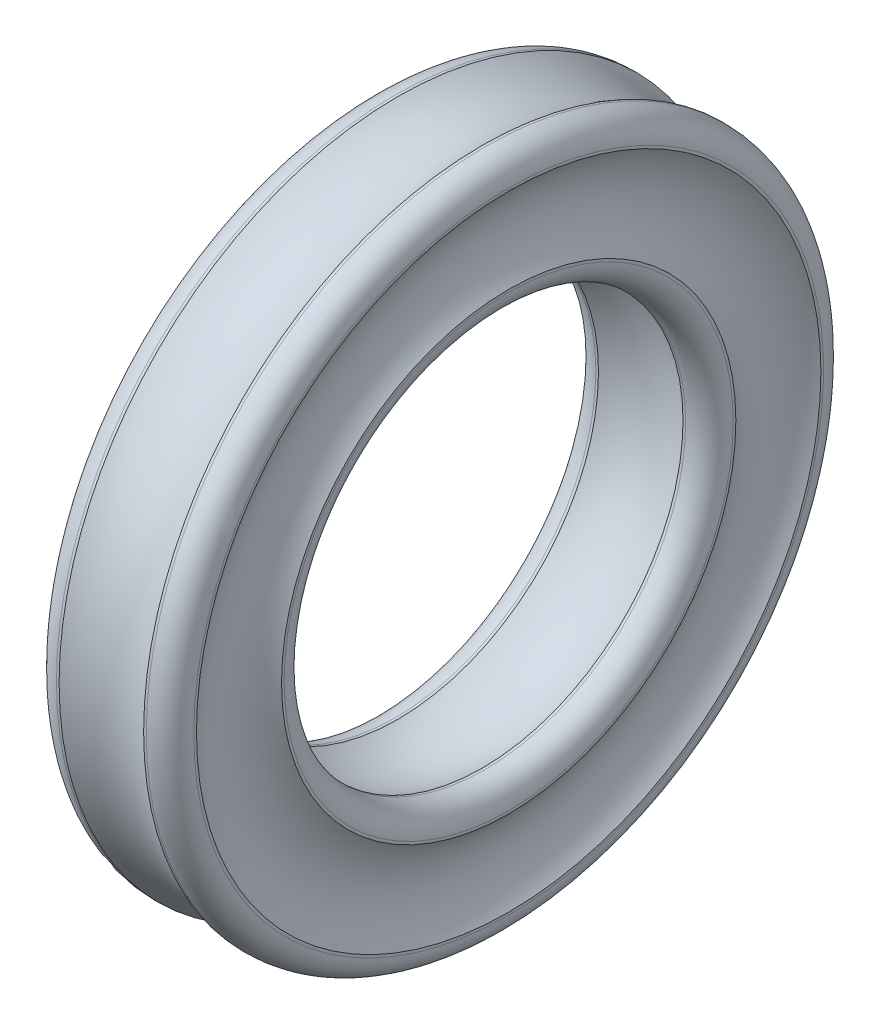
ISO-10303-21;
HEADER;
FILE_DESCRIPTION(('STEP AP214'),'2;1');
FILE_NAME('part.step','',(''),(''),'','','');
FILE_SCHEMA(('AUTOMOTIVE_DESIGN { 1 0 10303 214 1 1 1 1 }'));
ENDSEC;
DATA;
#1=APPLICATION_CONTEXT('core data for automotive mechanical design processes');
#2=APPLICATION_PROTOCOL_DEFINITION('international standard','automotive_design',2000,#1);
#3=PRODUCT_CONTEXT('',#1,'mechanical');
#4=PRODUCT('Part','Part','',(#3));
#5=PRODUCT_RELATED_PRODUCT_CATEGORY('part','',(#4));
#6=PRODUCT_DEFINITION_FORMATION('','',#4);
#7=PRODUCT_DEFINITION_CONTEXT('part definition',#1,'design');
#8=PRODUCT_DEFINITION('design','',#6,#7);
#9=PRODUCT_DEFINITION_SHAPE('','',#8);
#10=(LENGTH_UNIT() NAMED_UNIT(*) SI_UNIT(.MILLI.,.METRE.));
#11=(NAMED_UNIT(*) PLANE_ANGLE_UNIT() SI_UNIT($,.RADIAN.));
#12=(NAMED_UNIT(*) SI_UNIT($,.STERADIAN.) SOLID_ANGLE_UNIT());
#13=UNCERTAINTY_MEASURE_WITH_UNIT(LENGTH_MEASURE(1.E-05),#10,'distance_accuracy_value','');
#14=(GEOMETRIC_REPRESENTATION_CONTEXT(3) GLOBAL_UNCERTAINTY_ASSIGNED_CONTEXT((#13)) GLOBAL_UNIT_ASSIGNED_CONTEXT((#10,
#11,#12)) REPRESENTATION_CONTEXT('',''));
#15=CARTESIAN_POINT('',(0.,0.,0.));
#16=DIRECTION('',(0.,0.,1.));
#17=DIRECTION('',(1.,0.,0.));
#18=AXIS2_PLACEMENT_3D('',#15,#16,#17);
#19=CARTESIAN_POINT('',(1.3,5.91,0.));
#20=DIRECTION('',(-1.,0.,0.));
#21=DIRECTION('',(0.,0.,1.));
#22=AXIS2_PLACEMENT_3D('',#19,#20,#21);
#23=PLANE('',#22);
#24=CARTESIAN_POINT('',(1.3,0.,0.));
#25=DIRECTION('',(-1.,0.,0.));
#26=DIRECTION('',(0.,0.,1.));
#27=AXIS2_PLACEMENT_3D('',#24,#25,#26);
#28=CIRCLE('',#27,5.96);
#29=CARTESIAN_POINT('',(1.3,0.,5.96));
#30=VERTEX_POINT('',#29);
#31=EDGE_CURVE('E10',#30,#30,#28,.F.);
#32=ORIENTED_EDGE('',*,*,#31,.T.);
#33=EDGE_LOOP('',(#32));
#34=FACE_BOUND('',#33,.T.);
#35=CARTESIAN_POINT('',(1.3,0.,0.));
#36=DIRECTION('',(-1.,0.,0.));
#37=DIRECTION('',(0.,0.,1.));
#38=AXIS2_PLACEMENT_3D('',#35,#36,#37);
#39=CIRCLE('',#38,5.91);
#40=CARTESIAN_POINT('',(1.3,0.,5.91));
#41=VERTEX_POINT('',#40);
#42=EDGE_CURVE('E86',#41,#41,#39,.T.);
#43=ORIENTED_EDGE('',*,*,#42,.T.);
#44=EDGE_LOOP('',(#43));
#45=FACE_BOUND('',#44,.T.);
#46=ADVANCED_FACE('F34',(#34,#45),#23,.F.);
#47=CARTESIAN_POINT('',(0.,0.,0.));
#48=DIRECTION('',(-1.,0.,0.));
#49=DIRECTION('',(0.,0.,1.));
#50=AXIS2_PLACEMENT_3D('',#47,#48,#49);
#51=CYLINDRICAL_SURFACE('',#50,6.41);
#52=CARTESIAN_POINT('',(0.85,0.,0.));
#53=DIRECTION('',(-1.,0.,0.));
#54=DIRECTION('',(0.,0.,1.));
#55=AXIS2_PLACEMENT_3D('',#52,#53,#54);
#56=CIRCLE('',#55,6.41);
#57=CARTESIAN_POINT('',(0.85,0.,6.41));
#58=VERTEX_POINT('',#57);
#59=EDGE_CURVE('E45',#58,#58,#56,.T.);
#60=ORIENTED_EDGE('',*,*,#59,.T.);
#61=EDGE_LOOP('',(#60));
#62=FACE_BOUND('',#61,.T.);
#63=CARTESIAN_POINT('',(0.8,0.,0.));
#64=DIRECTION('',(-1.,0.,0.));
#65=DIRECTION('',(0.,0.,1.));
#66=AXIS2_PLACEMENT_3D('',#63,#64,#65);
#67=CIRCLE('',#66,6.41);
#68=CARTESIAN_POINT('',(0.8,0.,6.41));
#69=VERTEX_POINT('',#68);
#70=EDGE_CURVE('E69',#69,#69,#67,.T.);
#71=ORIENTED_EDGE('',*,*,#70,.F.);
#72=EDGE_LOOP('',(#71));
#73=FACE_BOUND('',#72,.T.);
#74=ADVANCED_FACE('F114',(#62,#73),#51,.T.);
#75=CARTESIAN_POINT('',(0.,0.,0.));
#76=DIRECTION('',(-1.,0.,0.));
#77=DIRECTION('',(0.,0.,1.));
#78=AXIS2_PLACEMENT_3D('',#75,#76,#77);
#79=TOROIDAL_SURFACE('',#78,7.79251104729134,1.59729045445173);
#80=CARTESIAN_POINT('',(-0.8,0.,0.));
#81=DIRECTION('',(-1.,0.,0.));
#82=DIRECTION('',(0.,0.,1.));
#83=AXIS2_PLACEMENT_3D('',#80,#81,#82);
#84=CIRCLE('',#83,6.41);
#85=CARTESIAN_POINT('',(-0.8,0.,6.41));
#86=VERTEX_POINT('',#85);
#87=EDGE_CURVE('E66',#86,#86,#84,.T.);
#88=ORIENTED_EDGE('',*,*,#87,.F.);
#89=EDGE_LOOP('',(#88));
#90=FACE_BOUND('',#89,.T.);
#91=ORIENTED_EDGE('',*,*,#70,.T.);
#92=EDGE_LOOP('',(#91));
#93=FACE_BOUND('',#92,.T.);
#94=ADVANCED_FACE('F117',(#90,#93),#79,.F.);
#95=CARTESIAN_POINT('',(0.,0.,0.));
#96=DIRECTION('',(-1.,0.,0.));
#97=DIRECTION('',(0.,0.,1.));
#98=AXIS2_PLACEMENT_3D('',#95,#96,#97);
#99=CYLINDRICAL_SURFACE('',#98,6.41);
#100=CARTESIAN_POINT('',(-0.85,0.,0.));
#101=DIRECTION('',(1.,0.,0.));
#102=DIRECTION('',(0.,0.,-1.));
#103=AXIS2_PLACEMENT_3D('',#100,#101,#102);
#104=CIRCLE('',#103,6.41);
#105=CARTESIAN_POINT('',(-0.85,0.,-6.41));
#106=VERTEX_POINT('',#105);
#107=EDGE_CURVE('E54',#106,#106,#104,.T.);
#108=ORIENTED_EDGE('',*,*,#107,.T.);
#109=EDGE_LOOP('',(#108));
#110=FACE_BOUND('',#109,.T.);
#111=ORIENTED_EDGE('',*,*,#87,.T.);
#112=EDGE_LOOP('',(#111));
#113=FACE_BOUND('',#112,.T.);
#114=ADVANCED_FACE('F162',(#110,#113),#99,.T.);
#115=CARTESIAN_POINT('',(-1.3,5.91,0.));
#116=DIRECTION('',(1.,0.,0.));
#117=DIRECTION('',(0.,0.,-1.));
#118=AXIS2_PLACEMENT_3D('',#115,#116,#117);
#119=PLANE('',#118);
#120=CARTESIAN_POINT('',(-1.3,0.,0.));
#121=DIRECTION('',(1.,0.,0.));
#122=DIRECTION('',(0.,0.,-1.));
#123=AXIS2_PLACEMENT_3D('',#120,#121,#122);
#124=CIRCLE('',#123,5.96);
#125=CARTESIAN_POINT('',(-1.3,0.,-5.96));
#126=VERTEX_POINT('',#125);
#127=EDGE_CURVE('E59',#126,#126,#124,.F.);
#128=ORIENTED_EDGE('',*,*,#127,.T.);
#129=EDGE_LOOP('',(#128));
#130=FACE_BOUND('',#129,.T.);
#131=CARTESIAN_POINT('',(-1.3,0.,0.));
#132=DIRECTION('',(-1.,0.,0.));
#133=DIRECTION('',(0.,0.,1.));
#134=AXIS2_PLACEMENT_3D('',#131,#132,#133);
#135=CIRCLE('',#134,5.91);
#136=CARTESIAN_POINT('',(-1.3,0.,5.91));
#137=VERTEX_POINT('',#136);
#138=EDGE_CURVE('E71',#137,#137,#135,.T.);
#139=ORIENTED_EDGE('',*,*,#138,.F.);
#140=EDGE_LOOP('',(#139));
#141=FACE_BOUND('',#140,.T.);
#142=ADVANCED_FACE('F157',(#130,#141),#119,.F.);
#143=CARTESIAN_POINT('',(-2.36556322767259,0.,0.));
#144=DIRECTION('',(-1.,0.,0.));
#145=DIRECTION('',(0.,0.,1.));
#146=AXIS2_PLACEMENT_3D('',#143,#144,#145);
#147=TOROIDAL_SURFACE('',#146,5.105,1.33545871975439);
#148=CARTESIAN_POINT('',(-1.3,0.,0.));
#149=DIRECTION('',(-1.,0.,0.));
#150=DIRECTION('',(0.,0.,1.));
#151=AXIS2_PLACEMENT_3D('',#148,#149,#150);
#152=CIRCLE('',#151,4.3);
#153=CARTESIAN_POINT('',(-1.3,0.,4.3));
#154=VERTEX_POINT('',#153);
#155=EDGE_CURVE('E76',#154,#154,#152,.T.);
#156=ORIENTED_EDGE('',*,*,#155,.F.);
#157=EDGE_LOOP('',(#156));
#158=FACE_BOUND('',#157,.T.);
#159=ORIENTED_EDGE('',*,*,#138,.T.);
#160=EDGE_LOOP('',(#159));
#161=FACE_BOUND('',#160,.T.);
#162=ADVANCED_FACE('F153',(#158,#161),#147,.F.);
#163=CARTESIAN_POINT('',(-1.3,3.8,0.));
#164=DIRECTION('',(1.,0.,0.));
#165=DIRECTION('',(0.,0.,-1.));
#166=AXIS2_PLACEMENT_3D('',#163,#164,#165);
#167=PLANE('',#166);
#168=CARTESIAN_POINT('',(-1.3,0.,0.));
#169=DIRECTION('',(1.,0.,0.));
#170=DIRECTION('',(0.,0.,-1.));
#171=AXIS2_PLACEMENT_3D('',#168,#169,#170);
#172=CIRCLE('',#171,4.25);
#173=CARTESIAN_POINT('',(-1.3,0.,-4.25));
#174=VERTEX_POINT('',#173);
#175=EDGE_CURVE('E61',#174,#174,#172,.T.);
#176=ORIENTED_EDGE('',*,*,#175,.T.);
#177=EDGE_LOOP('',(#176));
#178=FACE_BOUND('',#177,.T.);
#179=ORIENTED_EDGE('',*,*,#155,.T.);
#180=EDGE_LOOP('',(#179));
#181=FACE_BOUND('',#180,.T.);
#182=ADVANCED_FACE('F150',(#178,#181),#167,.F.);
#183=CARTESIAN_POINT('',(0.,0.,0.));
#184=DIRECTION('',(-1.,0.,0.));
#185=DIRECTION('',(0.,0.,1.));
#186=AXIS2_PLACEMENT_3D('',#183,#184,#185);
#187=CYLINDRICAL_SURFACE('',#186,3.8);
#188=CARTESIAN_POINT('',(-0.85,0.,0.));
#189=DIRECTION('',(1.,0.,0.));
#190=DIRECTION('',(0.,0.,-1.));
#191=AXIS2_PLACEMENT_3D('',#188,#189,#190);
#192=CIRCLE('',#191,3.8);
#193=CARTESIAN_POINT('',(-0.85,0.,-3.8));
#194=VERTEX_POINT('',#193);
#195=EDGE_CURVE('E63',#194,#194,#192,.F.);
#196=ORIENTED_EDGE('',*,*,#195,.T.);
#197=EDGE_LOOP('',(#196));
#198=FACE_BOUND('',#197,.T.);
#199=CARTESIAN_POINT('',(-0.8,0.,0.));
#200=DIRECTION('',(-1.,0.,0.));
#201=DIRECTION('',(0.,0.,1.));
#202=AXIS2_PLACEMENT_3D('',#199,#200,#201);
#203=CIRCLE('',#202,3.8);
#204=CARTESIAN_POINT('',(-0.8,0.,3.8));
#205=VERTEX_POINT('',#204);
#206=EDGE_CURVE('E78',#205,#205,#203,.T.);
#207=ORIENTED_EDGE('',*,*,#206,.F.);
#208=EDGE_LOOP('',(#207));
#209=FACE_BOUND('',#208,.T.);
#210=ADVANCED_FACE('F142',(#198,#209),#187,.F.);
#211=CARTESIAN_POINT('',(0.,0.,0.));
#212=DIRECTION('',(-1.,0.,0.));
#213=DIRECTION('',(0.,0.,1.));
#214=AXIS2_PLACEMENT_3D('',#211,#212,#213);
#215=TOROIDAL_SURFACE('',#214,2.41748895270866,1.59729045445173);
#216=CARTESIAN_POINT('',(0.799999999999999,0.,0.));
#217=DIRECTION('',(-1.,0.,0.));
#218=DIRECTION('',(0.,0.,1.));
#219=AXIS2_PLACEMENT_3D('',#216,#217,#218);
#220=CIRCLE('',#219,3.8);
#221=CARTESIAN_POINT('',(0.799999999999999,0.,3.8));
#222=VERTEX_POINT('',#221);
#223=EDGE_CURVE('E81',#222,#222,#220,.T.);
#224=ORIENTED_EDGE('',*,*,#223,.F.);
#225=EDGE_LOOP('',(#224));
#226=FACE_BOUND('',#225,.T.);
#227=ORIENTED_EDGE('',*,*,#206,.T.);
#228=EDGE_LOOP('',(#227));
#229=FACE_BOUND('',#228,.T.);
#230=ADVANCED_FACE('F108',(#226,#229),#215,.F.);
#231=CARTESIAN_POINT('',(0.,0.,0.));
#232=DIRECTION('',(-1.,0.,0.));
#233=DIRECTION('',(0.,0.,1.));
#234=AXIS2_PLACEMENT_3D('',#231,#232,#233);
#235=CYLINDRICAL_SURFACE('',#234,3.8);
#236=CARTESIAN_POINT('',(0.85,0.,0.));
#237=DIRECTION('',(-1.,0.,0.));
#238=DIRECTION('',(0.,0.,1.));
#239=AXIS2_PLACEMENT_3D('',#236,#237,#238);
#240=CIRCLE('',#239,3.8);
#241=CARTESIAN_POINT('',(0.85,0.,3.8));
#242=VERTEX_POINT('',#241);
#243=EDGE_CURVE('E46',#242,#242,#240,.F.);
#244=ORIENTED_EDGE('',*,*,#243,.T.);
#245=EDGE_LOOP('',(#244));
#246=FACE_BOUND('',#245,.T.);
#247=ORIENTED_EDGE('',*,*,#223,.T.);
#248=EDGE_LOOP('',(#247));
#249=FACE_BOUND('',#248,.T.);
#250=ADVANCED_FACE('F105',(#246,#249),#235,.F.);
#251=CARTESIAN_POINT('',(1.3,3.8,0.));
#252=DIRECTION('',(-1.,0.,0.));
#253=DIRECTION('',(0.,0.,1.));
#254=AXIS2_PLACEMENT_3D('',#251,#252,#253);
#255=PLANE('',#254);
#256=CARTESIAN_POINT('',(1.3,0.,0.));
#257=DIRECTION('',(-1.,0.,0.));
#258=DIRECTION('',(0.,0.,1.));
#259=AXIS2_PLACEMENT_3D('',#256,#257,#258);
#260=CIRCLE('',#259,4.25);
#261=CARTESIAN_POINT('',(1.3,0.,4.25));
#262=VERTEX_POINT('',#261);
#263=EDGE_CURVE('E49',#262,#262,#260,.T.);
#264=ORIENTED_EDGE('',*,*,#263,.T.);
#265=EDGE_LOOP('',(#264));
#266=FACE_BOUND('',#265,.T.);
#267=CARTESIAN_POINT('',(1.3,0.,0.));
#268=DIRECTION('',(-1.,0.,0.));
#269=DIRECTION('',(0.,0.,1.));
#270=AXIS2_PLACEMENT_3D('',#267,#268,#269);
#271=CIRCLE('',#270,4.3);
#272=CARTESIAN_POINT('',(1.3,0.,4.3));
#273=VERTEX_POINT('',#272);
#274=EDGE_CURVE('E82',#273,#273,#271,.T.);
#275=ORIENTED_EDGE('',*,*,#274,.F.);
#276=EDGE_LOOP('',(#275));
#277=FACE_BOUND('',#276,.T.);
#278=ADVANCED_FACE('F100',(#266,#277),#255,.F.);
#279=CARTESIAN_POINT('',(2.33760480956029,0.,0.));
#280=DIRECTION('',(-1.,0.,0.));
#281=DIRECTION('',(0.,0.,1.));
#282=AXIS2_PLACEMENT_3D('',#279,#280,#281);
#283=TOROIDAL_SURFACE('',#282,5.105,1.31325882476481);
#284=ORIENTED_EDGE('',*,*,#42,.F.);
#285=EDGE_LOOP('',(#284));
#286=FACE_BOUND('',#285,.T.);
#287=ORIENTED_EDGE('',*,*,#274,.T.);
#288=EDGE_LOOP('',(#287));
#289=FACE_BOUND('',#288,.T.);
#290=ADVANCED_FACE('F91',(#286,#289),#283,.F.);
#291=CARTESIAN_POINT('',(-0.85,0.,0.));
#292=DIRECTION('',(1.,0.,0.));
#293=DIRECTION('',(0.,0.,-1.));
#294=AXIS2_PLACEMENT_3D('',#291,#292,#293);
#295=TOROIDAL_SURFACE('',#294,4.25,0.45);
#296=ORIENTED_EDGE('',*,*,#175,.F.);
#297=EDGE_LOOP('',(#296));
#298=FACE_BOUND('',#297,.T.);
#299=ORIENTED_EDGE('',*,*,#195,.F.);
#300=EDGE_LOOP('',(#299));
#301=FACE_BOUND('',#300,.T.);
#302=ADVANCED_FACE('F96',(#298,#301),#295,.T.);
#303=CARTESIAN_POINT('',(-0.85,0.,0.));
#304=DIRECTION('',(1.,0.,0.));
#305=DIRECTION('',(0.,0.,-1.));
#306=AXIS2_PLACEMENT_3D('',#303,#304,#305);
#307=TOROIDAL_SURFACE('',#306,5.96,0.45);
#308=ORIENTED_EDGE('',*,*,#107,.F.);
#309=EDGE_LOOP('',(#308));
#310=FACE_BOUND('',#309,.T.);
#311=ORIENTED_EDGE('',*,*,#127,.F.);
#312=EDGE_LOOP('',(#311));
#313=FACE_BOUND('',#312,.T.);
#314=ADVANCED_FACE('F122',(#310,#313),#307,.T.);
#315=CARTESIAN_POINT('',(0.85,0.,0.));
#316=DIRECTION('',(-1.,0.,0.));
#317=DIRECTION('',(0.,0.,1.));
#318=AXIS2_PLACEMENT_3D('',#315,#316,#317);
#319=TOROIDAL_SURFACE('',#318,4.25,0.45);
#320=ORIENTED_EDGE('',*,*,#243,.F.);
#321=EDGE_LOOP('',(#320));
#322=FACE_BOUND('',#321,.T.);
#323=ORIENTED_EDGE('',*,*,#263,.F.);
#324=EDGE_LOOP('',(#323));
#325=FACE_BOUND('',#324,.T.);
#326=ADVANCED_FACE('F127',(#322,#325),#319,.T.);
#327=CARTESIAN_POINT('',(0.85,0.,0.));
#328=DIRECTION('',(-1.,0.,0.));
#329=DIRECTION('',(0.,0.,1.));
#330=AXIS2_PLACEMENT_3D('',#327,#328,#329);
#331=TOROIDAL_SURFACE('',#330,5.96,0.45);
#332=ORIENTED_EDGE('',*,*,#31,.F.);
#333=EDGE_LOOP('',(#332));
#334=FACE_BOUND('',#333,.T.);
#335=ORIENTED_EDGE('',*,*,#59,.F.);
#336=EDGE_LOOP('',(#335));
#337=FACE_BOUND('',#336,.T.);
#338=ADVANCED_FACE('F40',(#334,#337),#331,.T.);
#339=CLOSED_SHELL('',(#46,#74,#94,#114,#142,#162,#182,#210,#230,#250,#278,#290,#302,#314,#326,#338));
#340=MANIFOLD_SOLID_BREP('B2',#339);
#341=ADVANCED_BREP_SHAPE_REPRESENTATION('',(#18,#340),#14);
#342=SHAPE_DEFINITION_REPRESENTATION(#9,#341);
ENDSEC;
END-ISO-10303-21;
